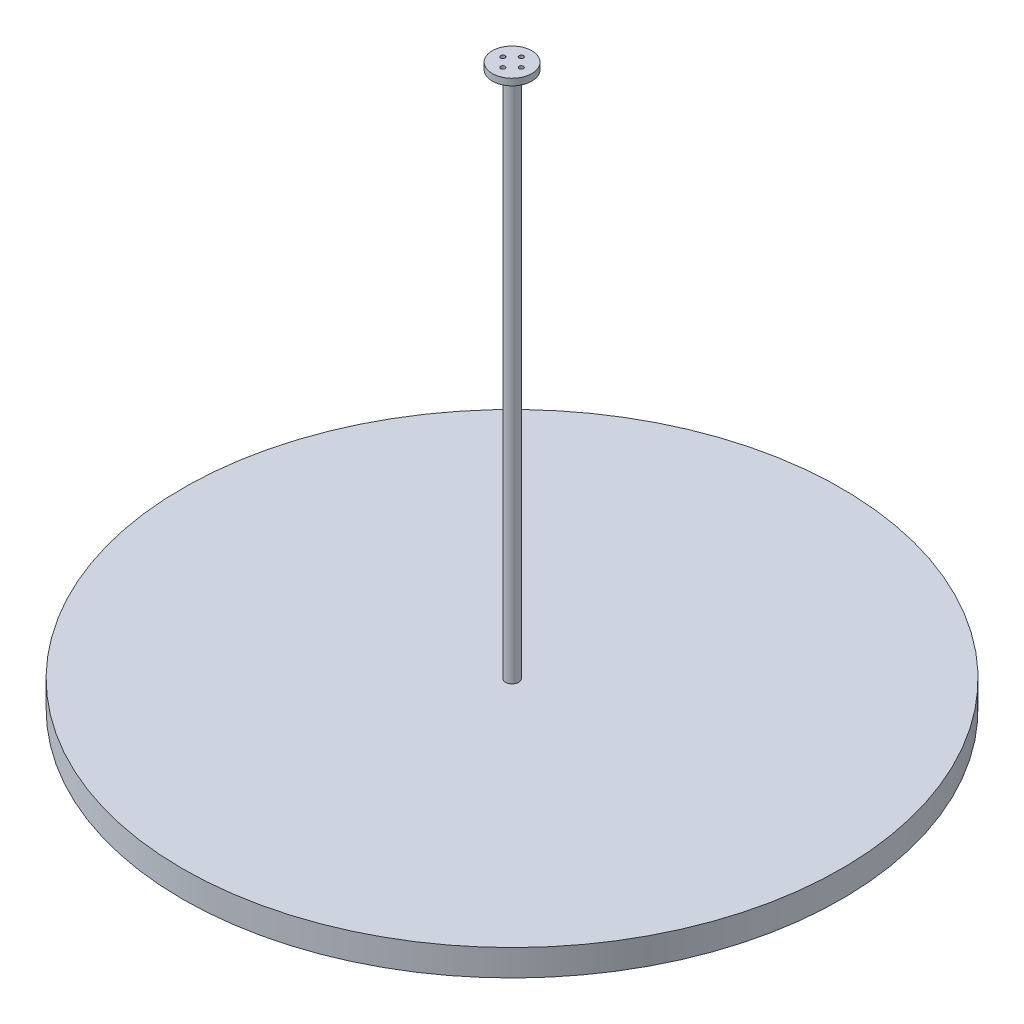
ISO-10303-21;
HEADER;
FILE_DESCRIPTION(('STEP AP214'),'2;1');
FILE_NAME('part.step','',(''),(''),'','','');
FILE_SCHEMA(('AUTOMOTIVE_DESIGN { 1 0 10303 214 1 1 1 1 }'));
ENDSEC;
DATA;
#1=APPLICATION_CONTEXT('core data for automotive mechanical design processes');
#2=APPLICATION_PROTOCOL_DEFINITION('international standard','automotive_design',2000,#1);
#3=PRODUCT_CONTEXT('',#1,'mechanical');
#4=PRODUCT('Part','Part','',(#3));
#5=PRODUCT_RELATED_PRODUCT_CATEGORY('part','',(#4));
#6=PRODUCT_DEFINITION_FORMATION('','',#4);
#7=PRODUCT_DEFINITION_CONTEXT('part definition',#1,'design');
#8=PRODUCT_DEFINITION('design','',#6,#7);
#9=PRODUCT_DEFINITION_SHAPE('','',#8);
#10=(LENGTH_UNIT() NAMED_UNIT(*) SI_UNIT(.MILLI.,.METRE.));
#11=(NAMED_UNIT(*) PLANE_ANGLE_UNIT() SI_UNIT($,.RADIAN.));
#12=(NAMED_UNIT(*) SI_UNIT($,.STERADIAN.) SOLID_ANGLE_UNIT());
#13=UNCERTAINTY_MEASURE_WITH_UNIT(LENGTH_MEASURE(1.E-05),#10,'distance_accuracy_value','');
#14=(GEOMETRIC_REPRESENTATION_CONTEXT(3) GLOBAL_UNCERTAINTY_ASSIGNED_CONTEXT((#13)) GLOBAL_UNIT_ASSIGNED_CONTEXT((#10,
#11,#12)) REPRESENTATION_CONTEXT('',''));
#15=CARTESIAN_POINT('',(0.,0.,0.));
#16=DIRECTION('',(0.,0.,1.));
#17=DIRECTION('',(1.,0.,0.));
#18=AXIS2_PLACEMENT_3D('',#15,#16,#17);
#19=CARTESIAN_POINT('',(0.,20.,0.));
#20=DIRECTION('',(0.,-1.,0.));
#21=DIRECTION('',(0.,0.,-1.));
#22=AXIS2_PLACEMENT_3D('',#19,#20,#21);
#23=CYLINDRICAL_SURFACE('',#22,250.);
#24=CARTESIAN_POINT('',(0.,20.,0.));
#25=DIRECTION('',(0.,1.,0.));
#26=DIRECTION('',(0.,0.,1.));
#27=AXIS2_PLACEMENT_3D('',#24,#25,#26);
#28=CIRCLE('',#27,250.);
#29=CARTESIAN_POINT('',(0.,20.,250.));
#30=VERTEX_POINT('',#29);
#31=EDGE_CURVE('E10',#30,#30,#28,.T.);
#32=ORIENTED_EDGE('',*,*,#31,.F.);
#33=EDGE_LOOP('',(#32));
#34=FACE_BOUND('',#33,.T.);
#35=CARTESIAN_POINT('',(0.,0.,0.));
#36=DIRECTION('',(0.,1.,0.));
#37=DIRECTION('',(0.,0.,1.));
#38=AXIS2_PLACEMENT_3D('',#35,#36,#37);
#39=CIRCLE('',#38,250.);
#40=CARTESIAN_POINT('',(0.,0.,250.));
#41=VERTEX_POINT('',#40);
#42=EDGE_CURVE('E43',#41,#41,#39,.T.);
#43=ORIENTED_EDGE('',*,*,#42,.T.);
#44=EDGE_LOOP('',(#43));
#45=FACE_BOUND('',#44,.T.);
#46=ADVANCED_FACE('F40',(#34,#45),#23,.T.);
#47=CARTESIAN_POINT('',(0.,20.,0.));
#48=DIRECTION('',(0.,1.,0.));
#49=DIRECTION('',(0.,0.,1.));
#50=AXIS2_PLACEMENT_3D('',#47,#48,#49);
#51=PLANE('',#50);
#52=CARTESIAN_POINT('',(0.,20.,0.));
#53=DIRECTION('',(0.,1.,0.));
#54=DIRECTION('',(0.,0.,1.));
#55=AXIS2_PLACEMENT_3D('',#52,#53,#54);
#56=CIRCLE('',#55,5.);
#57=CARTESIAN_POINT('',(0.,20.,5.));
#58=VERTEX_POINT('',#57);
#59=EDGE_CURVE('E55',#58,#58,#56,.T.);
#60=ORIENTED_EDGE('',*,*,#59,.F.);
#61=EDGE_LOOP('',(#60));
#62=FACE_BOUND('',#61,.T.);
#63=ORIENTED_EDGE('',*,*,#31,.T.);
#64=EDGE_LOOP('',(#63));
#65=FACE_BOUND('',#64,.T.);
#66=ADVANCED_FACE('F143',(#62,#65),#51,.T.);
#67=CARTESIAN_POINT('',(0.,0.,0.));
#68=DIRECTION('',(0.,1.,0.));
#69=DIRECTION('',(0.,0.,1.));
#70=AXIS2_PLACEMENT_3D('',#67,#68,#69);
#71=PLANE('',#70);
#72=ORIENTED_EDGE('',*,*,#42,.F.);
#73=EDGE_LOOP('',(#72));
#74=FACE_BOUND('',#73,.T.);
#75=ADVANCED_FACE('F148',(#74),#71,.F.);
#76=CARTESIAN_POINT('',(0.,420.,0.));
#77=DIRECTION('',(0.,-1.,0.));
#78=DIRECTION('',(0.,0.,-1.));
#79=AXIS2_PLACEMENT_3D('',#76,#77,#78);
#80=CYLINDRICAL_SURFACE('',#79,5.);
#81=CARTESIAN_POINT('',(0.,420.,0.));
#82=DIRECTION('',(0.,1.,0.));
#83=DIRECTION('',(0.,0.,1.));
#84=AXIS2_PLACEMENT_3D('',#81,#82,#83);
#85=CIRCLE('',#84,5.);
#86=CARTESIAN_POINT('',(0.,420.,5.));
#87=VERTEX_POINT('',#86);
#88=EDGE_CURVE('E53',#87,#87,#85,.T.);
#89=ORIENTED_EDGE('',*,*,#88,.F.);
#90=EDGE_LOOP('',(#89));
#91=FACE_BOUND('',#90,.T.);
#92=ORIENTED_EDGE('',*,*,#59,.T.);
#93=EDGE_LOOP('',(#92));
#94=FACE_BOUND('',#93,.T.);
#95=ADVANCED_FACE('F129',(#91,#94),#80,.T.);
#96=CARTESIAN_POINT('',(0.,425.,0.));
#97=DIRECTION('',(0.,-1.,0.));
#98=DIRECTION('',(0.,0.,-1.));
#99=AXIS2_PLACEMENT_3D('',#96,#97,#98);
#100=CYLINDRICAL_SURFACE('',#99,15.);
#101=CARTESIAN_POINT('',(0.,425.,0.));
#102=DIRECTION('',(0.,1.,0.));
#103=DIRECTION('',(0.,0.,1.));
#104=AXIS2_PLACEMENT_3D('',#101,#102,#103);
#105=CIRCLE('',#104,15.);
#106=CARTESIAN_POINT('',(0.,425.,15.));
#107=VERTEX_POINT('',#106);
#108=EDGE_CURVE('E59',#107,#107,#105,.T.);
#109=ORIENTED_EDGE('',*,*,#108,.F.);
#110=EDGE_LOOP('',(#109));
#111=FACE_BOUND('',#110,.T.);
#112=CARTESIAN_POINT('',(0.,420.,0.));
#113=DIRECTION('',(0.,1.,0.));
#114=DIRECTION('',(0.,0.,1.));
#115=AXIS2_PLACEMENT_3D('',#112,#113,#114);
#116=CIRCLE('',#115,15.);
#117=CARTESIAN_POINT('',(0.,420.,15.));
#118=VERTEX_POINT('',#117);
#119=EDGE_CURVE('E63',#118,#118,#116,.T.);
#120=ORIENTED_EDGE('',*,*,#119,.T.);
#121=EDGE_LOOP('',(#120));
#122=FACE_BOUND('',#121,.T.);
#123=ADVANCED_FACE('F117',(#111,#122),#100,.T.);
#124=CARTESIAN_POINT('',(0.,425.,0.));
#125=DIRECTION('',(0.,1.,0.));
#126=DIRECTION('',(0.,0.,1.));
#127=AXIS2_PLACEMENT_3D('',#124,#125,#126);
#128=PLANE('',#127);
#129=CARTESIAN_POINT('',(0.,425.,-7.));
#130=DIRECTION('',(0.,1.,0.));
#131=DIRECTION('',(-1.,0.,0.));
#132=AXIS2_PLACEMENT_3D('',#129,#130,#131);
#133=CIRCLE('',#132,1.65);
#134=CARTESIAN_POINT('',(-1.64999999999997,425.,-7.00000000000001));
#135=VERTEX_POINT('',#134);
#136=EDGE_CURVE('E95',#135,#135,#133,.T.);
#137=ORIENTED_EDGE('',*,*,#136,.F.);
#138=EDGE_LOOP('',(#137));
#139=FACE_BOUND('',#138,.T.);
#140=CARTESIAN_POINT('',(7.,425.,0.));
#141=DIRECTION('',(0.,1.,0.));
#142=DIRECTION('',(0.,0.,-1.));
#143=AXIS2_PLACEMENT_3D('',#140,#141,#142);
#144=CIRCLE('',#143,1.65);
#145=CARTESIAN_POINT('',(7.,425.,-1.65));
#146=VERTEX_POINT('',#145);
#147=EDGE_CURVE('E87',#146,#146,#144,.T.);
#148=ORIENTED_EDGE('',*,*,#147,.F.);
#149=EDGE_LOOP('',(#148));
#150=FACE_BOUND('',#149,.T.);
#151=CARTESIAN_POINT('',(0.,425.,7.));
#152=DIRECTION('',(0.,1.,0.));
#153=DIRECTION('',(1.,0.,0.));
#154=AXIS2_PLACEMENT_3D('',#151,#152,#153);
#155=CIRCLE('',#154,1.65);
#156=CARTESIAN_POINT('',(1.64999999999992,425.,7.00000000000002));
#157=VERTEX_POINT('',#156);
#158=EDGE_CURVE('E79',#157,#157,#155,.T.);
#159=ORIENTED_EDGE('',*,*,#158,.F.);
#160=EDGE_LOOP('',(#159));
#161=FACE_BOUND('',#160,.T.);
#162=CARTESIAN_POINT('',(-7.,425.,0.));
#163=DIRECTION('',(0.,1.,0.));
#164=DIRECTION('',(0.,0.,1.));
#165=AXIS2_PLACEMENT_3D('',#162,#163,#164);
#166=CIRCLE('',#165,1.65);
#167=CARTESIAN_POINT('',(-7.,425.,1.65));
#168=VERTEX_POINT('',#167);
#169=EDGE_CURVE('E71',#168,#168,#166,.T.);
#170=ORIENTED_EDGE('',*,*,#169,.F.);
#171=EDGE_LOOP('',(#170));
#172=FACE_BOUND('',#171,.T.);
#173=ORIENTED_EDGE('',*,*,#108,.T.);
#174=EDGE_LOOP('',(#173));
#175=FACE_BOUND('',#174,.T.);
#176=ADVANCED_FACE('F114',(#139,#150,#161,#172,#175),#128,.T.);
#177=CARTESIAN_POINT('',(0.,420.,0.));
#178=DIRECTION('',(0.,1.,0.));
#179=DIRECTION('',(0.,0.,1.));
#180=AXIS2_PLACEMENT_3D('',#177,#178,#179);
#181=PLANE('',#180);
#182=CARTESIAN_POINT('',(0.,420.,-7.));
#183=DIRECTION('',(0.,1.,0.));
#184=DIRECTION('',(-1.,0.,0.));
#185=AXIS2_PLACEMENT_3D('',#182,#183,#184);
#186=CIRCLE('',#185,1.65);
#187=CARTESIAN_POINT('',(-1.64999999999997,420.,-7.00000000000001));
#188=VERTEX_POINT('',#187);
#189=EDGE_CURVE('E75',#188,#188,#186,.T.);
#190=ORIENTED_EDGE('',*,*,#189,.T.);
#191=EDGE_LOOP('',(#190));
#192=FACE_BOUND('',#191,.T.);
#193=CARTESIAN_POINT('',(7.,420.,0.));
#194=DIRECTION('',(0.,1.,0.));
#195=DIRECTION('',(0.,0.,-1.));
#196=AXIS2_PLACEMENT_3D('',#193,#194,#195);
#197=CIRCLE('',#196,1.65);
#198=CARTESIAN_POINT('',(7.,420.,-1.65));
#199=VERTEX_POINT('',#198);
#200=EDGE_CURVE('E91',#199,#199,#197,.T.);
#201=ORIENTED_EDGE('',*,*,#200,.T.);
#202=EDGE_LOOP('',(#201));
#203=FACE_BOUND('',#202,.T.);
#204=CARTESIAN_POINT('',(0.,420.,7.));
#205=DIRECTION('',(0.,1.,0.));
#206=DIRECTION('',(1.,0.,0.));
#207=AXIS2_PLACEMENT_3D('',#204,#205,#206);
#208=CIRCLE('',#207,1.65);
#209=CARTESIAN_POINT('',(1.64999999999992,420.,7.00000000000002));
#210=VERTEX_POINT('',#209);
#211=EDGE_CURVE('E83',#210,#210,#208,.T.);
#212=ORIENTED_EDGE('',*,*,#211,.T.);
#213=EDGE_LOOP('',(#212));
#214=FACE_BOUND('',#213,.T.);
#215=CARTESIAN_POINT('',(-7.,420.,0.));
#216=DIRECTION('',(0.,1.,0.));
#217=DIRECTION('',(0.,0.,1.));
#218=AXIS2_PLACEMENT_3D('',#215,#216,#217);
#219=CIRCLE('',#218,1.65);
#220=CARTESIAN_POINT('',(-7.,420.,1.65));
#221=VERTEX_POINT('',#220);
#222=EDGE_CURVE('E67',#221,#221,#219,.T.);
#223=ORIENTED_EDGE('',*,*,#222,.T.);
#224=EDGE_LOOP('',(#223));
#225=FACE_BOUND('',#224,.T.);
#226=ORIENTED_EDGE('',*,*,#88,.T.);
#227=EDGE_LOOP('',(#226));
#228=FACE_BOUND('',#227,.T.);
#229=ORIENTED_EDGE('',*,*,#119,.F.);
#230=EDGE_LOOP('',(#229));
#231=FACE_BOUND('',#230,.T.);
#232=ADVANCED_FACE('F104',(#192,#203,#214,#225,#228,#231),#181,.F.);
#233=CARTESIAN_POINT('',(-7.,420.,0.));
#234=DIRECTION('',(0.,1.,0.));
#235=DIRECTION('',(0.,0.,1.));
#236=AXIS2_PLACEMENT_3D('',#233,#234,#235);
#237=CYLINDRICAL_SURFACE('',#236,1.65);
#238=ORIENTED_EDGE('',*,*,#222,.F.);
#239=EDGE_LOOP('',(#238));
#240=FACE_BOUND('',#239,.T.);
#241=ORIENTED_EDGE('',*,*,#169,.T.);
#242=EDGE_LOOP('',(#241));
#243=FACE_BOUND('',#242,.T.);
#244=ADVANCED_FACE('F134',(#240,#243),#237,.F.);
#245=CARTESIAN_POINT('',(0.,420.,7.));
#246=DIRECTION('',(0.,1.,0.));
#247=DIRECTION('',(0.,0.,1.));
#248=AXIS2_PLACEMENT_3D('',#245,#246,#247);
#249=CYLINDRICAL_SURFACE('',#248,1.65);
#250=ORIENTED_EDGE('',*,*,#211,.F.);
#251=EDGE_LOOP('',(#250));
#252=FACE_BOUND('',#251,.T.);
#253=ORIENTED_EDGE('',*,*,#158,.T.);
#254=EDGE_LOOP('',(#253));
#255=FACE_BOUND('',#254,.T.);
#256=ADVANCED_FACE('F139',(#252,#255),#249,.F.);
#257=CARTESIAN_POINT('',(7.,420.,0.));
#258=DIRECTION('',(0.,1.,0.));
#259=DIRECTION('',(0.,0.,1.));
#260=AXIS2_PLACEMENT_3D('',#257,#258,#259);
#261=CYLINDRICAL_SURFACE('',#260,1.65);
#262=ORIENTED_EDGE('',*,*,#200,.F.);
#263=EDGE_LOOP('',(#262));
#264=FACE_BOUND('',#263,.T.);
#265=ORIENTED_EDGE('',*,*,#147,.T.);
#266=EDGE_LOOP('',(#265));
#267=FACE_BOUND('',#266,.T.);
#268=ADVANCED_FACE('F110',(#264,#267),#261,.F.);
#269=CARTESIAN_POINT('',(0.,420.,-7.));
#270=DIRECTION('',(0.,1.,0.));
#271=DIRECTION('',(0.,0.,1.));
#272=AXIS2_PLACEMENT_3D('',#269,#270,#271);
#273=CYLINDRICAL_SURFACE('',#272,1.65);
#274=ORIENTED_EDGE('',*,*,#189,.F.);
#275=EDGE_LOOP('',(#274));
#276=FACE_BOUND('',#275,.T.);
#277=ORIENTED_EDGE('',*,*,#136,.T.);
#278=EDGE_LOOP('',(#277));
#279=FACE_BOUND('',#278,.T.);
#280=ADVANCED_FACE('F107',(#276,#279),#273,.F.);
#281=CLOSED_SHELL('',(#46,#66,#75,#95,#123,#176,#232,#244,#256,#268,#280));
#282=MANIFOLD_SOLID_BREP('B2',#281);
#283=ADVANCED_BREP_SHAPE_REPRESENTATION('',(#18,#282),#14);
#284=SHAPE_DEFINITION_REPRESENTATION(#9,#283);
ENDSEC;
END-ISO-10303-21;
